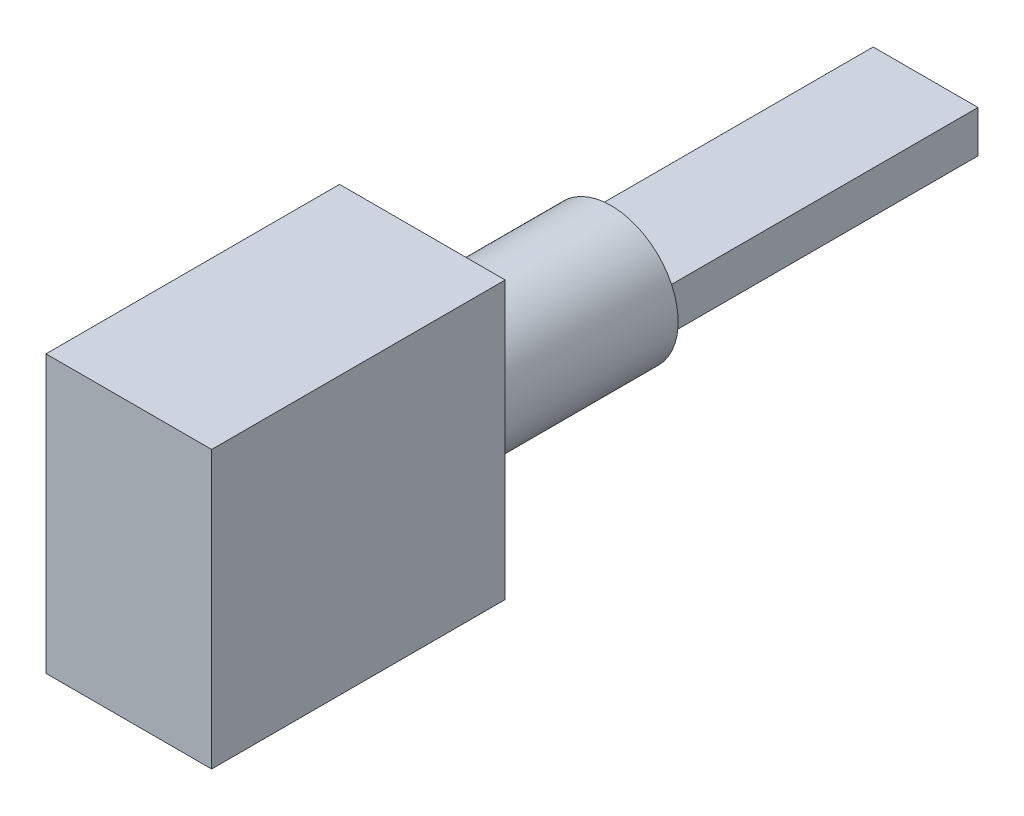
ISO-10303-21;
HEADER;
FILE_DESCRIPTION(('STEP AP214'),'2;1');
FILE_NAME('part.step','',(''),(''),'','','');
FILE_SCHEMA(('AUTOMOTIVE_DESIGN { 1 0 10303 214 1 1 1 1 }'));
ENDSEC;
DATA;
#1=APPLICATION_CONTEXT('core data for automotive mechanical design processes');
#2=APPLICATION_PROTOCOL_DEFINITION('international standard','automotive_design',2000,#1);
#3=PRODUCT_CONTEXT('',#1,'mechanical');
#4=PRODUCT('Part','Part','',(#3));
#5=PRODUCT_RELATED_PRODUCT_CATEGORY('part','',(#4));
#6=PRODUCT_DEFINITION_FORMATION('','',#4);
#7=PRODUCT_DEFINITION_CONTEXT('part definition',#1,'design');
#8=PRODUCT_DEFINITION('design','',#6,#7);
#9=PRODUCT_DEFINITION_SHAPE('','',#8);
#10=(LENGTH_UNIT() NAMED_UNIT(*) SI_UNIT(.MILLI.,.METRE.));
#11=(NAMED_UNIT(*) PLANE_ANGLE_UNIT() SI_UNIT($,.RADIAN.));
#12=(NAMED_UNIT(*) SI_UNIT($,.STERADIAN.) SOLID_ANGLE_UNIT());
#13=UNCERTAINTY_MEASURE_WITH_UNIT(LENGTH_MEASURE(1.E-05),#10,'distance_accuracy_value','');
#14=(GEOMETRIC_REPRESENTATION_CONTEXT(3) GLOBAL_UNCERTAINTY_ASSIGNED_CONTEXT((#13)) GLOBAL_UNIT_ASSIGNED_CONTEXT((#10,
#11,#12)) REPRESENTATION_CONTEXT('',''));
#15=CARTESIAN_POINT('',(0.,0.,0.));
#16=DIRECTION('',(0.,0.,1.));
#17=DIRECTION('',(1.,0.,0.));
#18=AXIS2_PLACEMENT_3D('',#15,#16,#17);
#19=CARTESIAN_POINT('',(-24.6655198451616,-72.3074440446684,14.));
#20=DIRECTION('',(-1.,0.,0.));
#21=DIRECTION('',(0.,-1.,0.));
#22=AXIS2_PLACEMENT_3D('',#19,#20,#21);
#23=PLANE('',#22);
#24=DIRECTION('',(0.,1.,0.));
#25=VECTOR('',#24,1.);
#26=CARTESIAN_POINT('',(-24.6655198451616,-72.3074440446684,0.));
#27=LINE('',#26,#25);
#28=CARTESIAN_POINT('',(-24.6655198451616,-72.3074440446684,0.));
#29=VERTEX_POINT('',#28);
#30=CARTESIAN_POINT('',(-24.6655198451616,-59.1074440446684,0.));
#31=VERTEX_POINT('',#30);
#32=EDGE_CURVE('E121',#29,#31,#27,.T.);
#33=ORIENTED_EDGE('',*,*,#32,.T.);
#34=DIRECTION('',(0.,0.,-1.));
#35=VECTOR('',#34,1.);
#36=CARTESIAN_POINT('',(-24.6655198451616,-59.1074440446684,14.));
#37=LINE('',#36,#35);
#38=CARTESIAN_POINT('',(-24.6655198451616,-59.1074440446684,14.));
#39=VERTEX_POINT('',#38);
#40=EDGE_CURVE('E36',#39,#31,#37,.T.);
#41=ORIENTED_EDGE('',*,*,#40,.F.);
#42=DIRECTION('',(0.,1.,0.));
#43=VECTOR('',#42,1.);
#44=CARTESIAN_POINT('',(-24.6655198451616,-72.3074440446684,14.));
#45=LINE('',#44,#43);
#46=CARTESIAN_POINT('',(-24.6655198451616,-72.3074440446684,14.));
#47=VERTEX_POINT('',#46);
#48=EDGE_CURVE('E127',#47,#39,#45,.T.);
#49=ORIENTED_EDGE('',*,*,#48,.F.);
#50=DIRECTION('',(0.,0.,-1.));
#51=VECTOR('',#50,1.);
#52=CARTESIAN_POINT('',(-24.6655198451616,-72.3074440446684,14.));
#53=LINE('',#52,#51);
#54=EDGE_CURVE('E137',#47,#29,#53,.T.);
#55=ORIENTED_EDGE('',*,*,#54,.T.);
#56=EDGE_LOOP('',(#33,#41,#49,#55));
#57=FACE_BOUND('',#56,.T.);
#58=ADVANCED_FACE('F33',(#57),#23,.F.);
#59=CARTESIAN_POINT('',(-24.6655198451616,-59.1074440446684,14.));
#60=DIRECTION('',(0.,-1.,0.));
#61=DIRECTION('',(1.,0.,0.));
#62=AXIS2_PLACEMENT_3D('',#59,#60,#61);
#63=PLANE('',#62);
#64=DIRECTION('',(-1.,0.,0.));
#65=VECTOR('',#64,1.);
#66=CARTESIAN_POINT('',(-24.6655198451616,-59.1074440446684,0.));
#67=LINE('',#66,#65);
#68=CARTESIAN_POINT('',(-32.5655198451616,-59.1074440446684,0.));
#69=VERTEX_POINT('',#68);
#70=EDGE_CURVE('E140',#31,#69,#67,.T.);
#71=ORIENTED_EDGE('',*,*,#70,.T.);
#72=DIRECTION('',(0.,0.,-1.));
#73=VECTOR('',#72,1.);
#74=CARTESIAN_POINT('',(-32.5655198451616,-59.1074440446684,14.));
#75=LINE('',#74,#73);
#76=CARTESIAN_POINT('',(-32.5655198451616,-59.1074440446684,14.));
#77=VERTEX_POINT('',#76);
#78=EDGE_CURVE('E149',#77,#69,#75,.T.);
#79=ORIENTED_EDGE('',*,*,#78,.F.);
#80=DIRECTION('',(-1.,0.,0.));
#81=VECTOR('',#80,1.);
#82=CARTESIAN_POINT('',(-24.6655198451616,-59.1074440446684,14.));
#83=LINE('',#82,#81);
#84=EDGE_CURVE('E130',#39,#77,#83,.T.);
#85=ORIENTED_EDGE('',*,*,#84,.F.);
#86=ORIENTED_EDGE('',*,*,#40,.T.);
#87=EDGE_LOOP('',(#71,#79,#85,#86));
#88=FACE_BOUND('',#87,.T.);
#89=ADVANCED_FACE('F158',(#88),#63,.F.);
#90=CARTESIAN_POINT('',(-32.5655198451616,-72.3074440446684,14.));
#91=DIRECTION('',(1.,0.,0.));
#92=DIRECTION('',(0.,0.,-1.));
#93=AXIS2_PLACEMENT_3D('',#90,#91,#92);
#94=PLANE('',#93);
#95=DIRECTION('',(0.,-1.,0.));
#96=VECTOR('',#95,1.);
#97=CARTESIAN_POINT('',(-32.5655198451616,-72.3074440446684,0.));
#98=LINE('',#97,#96);
#99=CARTESIAN_POINT('',(-32.5655198451616,-72.3074440446684,0.));
#100=VERTEX_POINT('',#99);
#101=EDGE_CURVE('E142',#69,#100,#98,.T.);
#102=ORIENTED_EDGE('',*,*,#101,.T.);
#103=DIRECTION('',(0.,0.,-1.));
#104=VECTOR('',#103,1.);
#105=CARTESIAN_POINT('',(-32.5655198451616,-72.3074440446684,14.));
#106=LINE('',#105,#104);
#107=CARTESIAN_POINT('',(-32.5655198451616,-72.3074440446684,14.));
#108=VERTEX_POINT('',#107);
#109=EDGE_CURVE('E147',#108,#100,#106,.T.);
#110=ORIENTED_EDGE('',*,*,#109,.F.);
#111=DIRECTION('',(0.,-1.,0.));
#112=VECTOR('',#111,1.);
#113=CARTESIAN_POINT('',(-32.5655198451616,-72.3074440446684,14.));
#114=LINE('',#113,#112);
#115=EDGE_CURVE('E133',#77,#108,#114,.T.);
#116=ORIENTED_EDGE('',*,*,#115,.F.);
#117=ORIENTED_EDGE('',*,*,#78,.T.);
#118=EDGE_LOOP('',(#102,#110,#116,#117));
#119=FACE_BOUND('',#118,.T.);
#120=ADVANCED_FACE('F167',(#119),#94,.F.);
#121=CARTESIAN_POINT('',(-24.6655198451616,-72.3074440446684,14.));
#122=DIRECTION('',(0.,1.,0.));
#123=DIRECTION('',(0.,0.,1.));
#124=AXIS2_PLACEMENT_3D('',#121,#122,#123);
#125=PLANE('',#124);
#126=DIRECTION('',(1.,0.,0.));
#127=VECTOR('',#126,1.);
#128=CARTESIAN_POINT('',(-24.6655198451616,-72.3074440446684,0.));
#129=LINE('',#128,#127);
#130=EDGE_CURVE('E131',#100,#29,#129,.T.);
#131=ORIENTED_EDGE('',*,*,#130,.T.);
#132=ORIENTED_EDGE('',*,*,#54,.F.);
#133=DIRECTION('',(1.,0.,0.));
#134=VECTOR('',#133,1.);
#135=CARTESIAN_POINT('',(-24.6655198451616,-72.3074440446684,14.));
#136=LINE('',#135,#134);
#137=EDGE_CURVE('E135',#108,#47,#136,.T.);
#138=ORIENTED_EDGE('',*,*,#137,.F.);
#139=ORIENTED_EDGE('',*,*,#109,.T.);
#140=EDGE_LOOP('',(#131,#132,#138,#139));
#141=FACE_BOUND('',#140,.T.);
#142=ADVANCED_FACE('F170',(#141),#125,.F.);
#143=CARTESIAN_POINT('',(0.,0.,14.));
#144=DIRECTION('',(0.,0.,1.));
#145=DIRECTION('',(1.,0.,0.));
#146=AXIS2_PLACEMENT_3D('',#143,#144,#145);
#147=PLANE('',#146);
#148=ORIENTED_EDGE('',*,*,#48,.T.);
#149=ORIENTED_EDGE('',*,*,#84,.T.);
#150=ORIENTED_EDGE('',*,*,#115,.T.);
#151=ORIENTED_EDGE('',*,*,#137,.T.);
#152=EDGE_LOOP('',(#148,#149,#150,#151));
#153=FACE_BOUND('',#152,.T.);
#154=ADVANCED_FACE('F172',(#153),#147,.T.);
#155=CARTESIAN_POINT('',(0.,0.,0.));
#156=DIRECTION('',(0.,0.,1.));
#157=DIRECTION('',(1.,0.,0.));
#158=AXIS2_PLACEMENT_3D('',#155,#156,#157);
#159=PLANE('',#158);
#160=CARTESIAN_POINT('',(-28.6155198451616,-65.7074440446684,0.));
#161=DIRECTION('',(0.,0.,-1.));
#162=DIRECTION('',(-1.,0.,0.));
#163=AXIS2_PLACEMENT_3D('',#160,#161,#162);
#164=CIRCLE('',#163,3.2);
#165=CARTESIAN_POINT('',(-31.8155198451616,-65.7074440446684,0.));
#166=VERTEX_POINT('',#165);
#167=EDGE_CURVE('E11',#166,#166,#164,.T.);
#168=ORIENTED_EDGE('',*,*,#167,.F.);
#169=EDGE_LOOP('',(#168));
#170=FACE_BOUND('',#169,.T.);
#171=ORIENTED_EDGE('',*,*,#32,.F.);
#172=ORIENTED_EDGE('',*,*,#130,.F.);
#173=ORIENTED_EDGE('',*,*,#101,.F.);
#174=ORIENTED_EDGE('',*,*,#70,.F.);
#175=EDGE_LOOP('',(#171,#172,#173,#174));
#176=FACE_BOUND('',#175,.T.);
#177=ADVANCED_FACE('F165',(#170,#176),#159,.F.);
#178=CARTESIAN_POINT('',(-28.6155198451616,-65.7074440446684,-9.));
#179=DIRECTION('',(0.,0.,1.));
#180=DIRECTION('',(1.,0.,0.));
#181=AXIS2_PLACEMENT_3D('',#178,#179,#180);
#182=CYLINDRICAL_SURFACE('',#181,3.2);
#183=CARTESIAN_POINT('',(-28.6155198451616,-65.7074440446684,-9.));
#184=DIRECTION('',(0.,0.,-1.));
#185=DIRECTION('',(-1.,0.,0.));
#186=AXIS2_PLACEMENT_3D('',#183,#184,#185);
#187=CIRCLE('',#186,3.2);
#188=CARTESIAN_POINT('',(-31.8155198451616,-65.7074440446684,-9.));
#189=VERTEX_POINT('',#188);
#190=EDGE_CURVE('E118',#189,#189,#187,.T.);
#191=ORIENTED_EDGE('',*,*,#190,.F.);
#192=EDGE_LOOP('',(#191));
#193=FACE_BOUND('',#192,.T.);
#194=ORIENTED_EDGE('',*,*,#167,.T.);
#195=EDGE_LOOP('',(#194));
#196=FACE_BOUND('',#195,.T.);
#197=ADVANCED_FACE('F179',(#193,#196),#182,.T.);
#198=CARTESIAN_POINT('',(-28.6155198451616,-65.7074440446684,-9.));
#199=DIRECTION('',(0.,0.,-1.));
#200=DIRECTION('',(-1.,0.,0.));
#201=AXIS2_PLACEMENT_3D('',#198,#199,#200);
#202=PLANE('',#201);
#203=DIRECTION('',(0.,-1.,0.));
#204=VECTOR('',#203,1.);
#205=CARTESIAN_POINT('',(-26.1155198451616,-64.7074440446684,-9.));
#206=LINE('',#205,#204);
#207=CARTESIAN_POINT('',(-26.1155198451616,-64.7074440446684,-9.));
#208=VERTEX_POINT('',#207);
#209=CARTESIAN_POINT('',(-26.1155198451616,-66.7074440446684,-9.));
#210=VERTEX_POINT('',#209);
#211=EDGE_CURVE('E48',#208,#210,#206,.T.);
#212=ORIENTED_EDGE('',*,*,#211,.F.);
#213=DIRECTION('',(1.,0.,0.));
#214=VECTOR('',#213,1.);
#215=CARTESIAN_POINT('',(-26.1155198451616,-64.7074440446684,-9.));
#216=LINE('',#215,#214);
#217=CARTESIAN_POINT('',(-31.1155198451616,-64.7074440446684,-9.));
#218=VERTEX_POINT('',#217);
#219=EDGE_CURVE('E52',#218,#208,#216,.T.);
#220=ORIENTED_EDGE('',*,*,#219,.F.);
#221=DIRECTION('',(0.,1.,0.));
#222=VECTOR('',#221,1.);
#223=CARTESIAN_POINT('',(-31.1155198451616,-64.7074440446684,-9.));
#224=LINE('',#223,#222);
#225=CARTESIAN_POINT('',(-31.1155198451616,-66.7074440446684,-9.));
#226=VERTEX_POINT('',#225);
#227=EDGE_CURVE('E276',#226,#218,#224,.T.);
#228=ORIENTED_EDGE('',*,*,#227,.F.);
#229=DIRECTION('',(-1.,0.,0.));
#230=VECTOR('',#229,1.);
#231=CARTESIAN_POINT('',(-26.1155198451616,-66.7074440446684,-9.));
#232=LINE('',#231,#230);
#233=EDGE_CURVE('E282',#210,#226,#232,.T.);
#234=ORIENTED_EDGE('',*,*,#233,.F.);
#235=EDGE_LOOP('',(#212,#220,#228,#234));
#236=FACE_BOUND('',#235,.T.);
#237=ORIENTED_EDGE('',*,*,#190,.T.);
#238=EDGE_LOOP('',(#237));
#239=FACE_BOUND('',#238,.T.);
#240=ADVANCED_FACE('F217',(#236,#239),#202,.T.);
#241=CARTESIAN_POINT('',(-26.1155198451616,-64.7074440446684,-24.));
#242=DIRECTION('',(-1.,0.,0.));
#243=DIRECTION('',(0.,0.,1.));
#244=AXIS2_PLACEMENT_3D('',#241,#242,#243);
#245=PLANE('',#244);
#246=ORIENTED_EDGE('',*,*,#211,.T.);
#247=DIRECTION('',(0.,0.,1.));
#248=VECTOR('',#247,1.);
#249=CARTESIAN_POINT('',(-26.1155198451616,-66.7074440446684,-24.));
#250=LINE('',#249,#248);
#251=CARTESIAN_POINT('',(-26.1155198451616,-66.7074440446684,-24.));
#252=VERTEX_POINT('',#251);
#253=EDGE_CURVE('E101',#252,#210,#250,.T.);
#254=ORIENTED_EDGE('',*,*,#253,.F.);
#255=DIRECTION('',(0.,-1.,0.));
#256=VECTOR('',#255,1.);
#257=CARTESIAN_POINT('',(-26.1155198451616,-64.7074440446684,-24.));
#258=LINE('',#257,#256);
#259=CARTESIAN_POINT('',(-26.1155198451616,-64.7074440446684,-24.));
#260=VERTEX_POINT('',#259);
#261=EDGE_CURVE('E107',#260,#252,#258,.T.);
#262=ORIENTED_EDGE('',*,*,#261,.F.);
#263=DIRECTION('',(0.,0.,1.));
#264=VECTOR('',#263,1.);
#265=CARTESIAN_POINT('',(-26.1155198451616,-64.7074440446684,-24.));
#266=LINE('',#265,#264);
#267=EDGE_CURVE('E274',#260,#208,#266,.T.);
#268=ORIENTED_EDGE('',*,*,#267,.T.);
#269=EDGE_LOOP('',(#246,#254,#262,#268));
#270=FACE_BOUND('',#269,.T.);
#271=ADVANCED_FACE('F117',(#270),#245,.F.);
#272=CARTESIAN_POINT('',(-26.1155198451616,-66.7074440446684,-24.));
#273=DIRECTION('',(0.,1.,0.));
#274=DIRECTION('',(0.,0.,1.));
#275=AXIS2_PLACEMENT_3D('',#272,#273,#274);
#276=PLANE('',#275);
#277=ORIENTED_EDGE('',*,*,#233,.T.);
#278=DIRECTION('',(0.,0.,1.));
#279=VECTOR('',#278,1.);
#280=CARTESIAN_POINT('',(-31.1155198451616,-66.7074440446684,-24.));
#281=LINE('',#280,#279);
#282=CARTESIAN_POINT('',(-31.1155198451616,-66.7074440446684,-24.));
#283=VERTEX_POINT('',#282);
#284=EDGE_CURVE('E103',#283,#226,#281,.T.);
#285=ORIENTED_EDGE('',*,*,#284,.F.);
#286=DIRECTION('',(-1.,0.,0.));
#287=VECTOR('',#286,1.);
#288=CARTESIAN_POINT('',(-26.1155198451616,-66.7074440446684,-24.));
#289=LINE('',#288,#287);
#290=EDGE_CURVE('E96',#252,#283,#289,.T.);
#291=ORIENTED_EDGE('',*,*,#290,.F.);
#292=ORIENTED_EDGE('',*,*,#253,.T.);
#293=EDGE_LOOP('',(#277,#285,#291,#292));
#294=FACE_BOUND('',#293,.T.);
#295=ADVANCED_FACE('F99',(#294),#276,.F.);
#296=CARTESIAN_POINT('',(-31.1155198451616,-64.7074440446684,-24.));
#297=DIRECTION('',(1.,0.,0.));
#298=DIRECTION('',(0.,0.,-1.));
#299=AXIS2_PLACEMENT_3D('',#296,#297,#298);
#300=PLANE('',#299);
#301=ORIENTED_EDGE('',*,*,#227,.T.);
#302=DIRECTION('',(0.,0.,1.));
#303=VECTOR('',#302,1.);
#304=CARTESIAN_POINT('',(-31.1155198451616,-64.7074440446684,-24.));
#305=LINE('',#304,#303);
#306=CARTESIAN_POINT('',(-31.1155198451616,-64.7074440446684,-24.));
#307=VERTEX_POINT('',#306);
#308=EDGE_CURVE('E123',#307,#218,#305,.T.);
#309=ORIENTED_EDGE('',*,*,#308,.F.);
#310=DIRECTION('',(0.,1.,0.));
#311=VECTOR('',#310,1.);
#312=CARTESIAN_POINT('',(-31.1155198451616,-64.7074440446684,-24.));
#313=LINE('',#312,#311);
#314=EDGE_CURVE('E106',#283,#307,#313,.T.);
#315=ORIENTED_EDGE('',*,*,#314,.F.);
#316=ORIENTED_EDGE('',*,*,#284,.T.);
#317=EDGE_LOOP('',(#301,#309,#315,#316));
#318=FACE_BOUND('',#317,.T.);
#319=ADVANCED_FACE('F242',(#318),#300,.F.);
#320=CARTESIAN_POINT('',(-26.1155198451616,-64.7074440446684,-24.));
#321=DIRECTION('',(0.,-1.,0.));
#322=DIRECTION('',(0.,0.,-1.));
#323=AXIS2_PLACEMENT_3D('',#320,#321,#322);
#324=PLANE('',#323);
#325=ORIENTED_EDGE('',*,*,#219,.T.);
#326=ORIENTED_EDGE('',*,*,#267,.F.);
#327=DIRECTION('',(1.,0.,0.));
#328=VECTOR('',#327,1.);
#329=CARTESIAN_POINT('',(-26.1155198451616,-64.7074440446684,-24.));
#330=LINE('',#329,#328);
#331=EDGE_CURVE('E112',#307,#260,#330,.T.);
#332=ORIENTED_EDGE('',*,*,#331,.F.);
#333=ORIENTED_EDGE('',*,*,#308,.T.);
#334=EDGE_LOOP('',(#325,#326,#332,#333));
#335=FACE_BOUND('',#334,.T.);
#336=ADVANCED_FACE('F251',(#335),#324,.F.);
#337=CARTESIAN_POINT('',(0.,0.,-24.));
#338=DIRECTION('',(0.,0.,-1.));
#339=DIRECTION('',(-1.,0.,0.));
#340=AXIS2_PLACEMENT_3D('',#337,#338,#339);
#341=PLANE('',#340);
#342=ORIENTED_EDGE('',*,*,#261,.T.);
#343=ORIENTED_EDGE('',*,*,#290,.T.);
#344=ORIENTED_EDGE('',*,*,#314,.T.);
#345=ORIENTED_EDGE('',*,*,#331,.T.);
#346=EDGE_LOOP('',(#342,#343,#344,#345));
#347=FACE_BOUND('',#346,.T.);
#348=ADVANCED_FACE('F110',(#347),#341,.T.);
#349=CLOSED_SHELL('',(#58,#89,#120,#142,#154,#177,#197,#240,#271,#295,#319,#336,#348));
#350=MANIFOLD_SOLID_BREP('B2',#349);
#351=ADVANCED_BREP_SHAPE_REPRESENTATION('',(#18,#350),#14);
#352=SHAPE_DEFINITION_REPRESENTATION(#9,#351);
ENDSEC;
END-ISO-10303-21;
